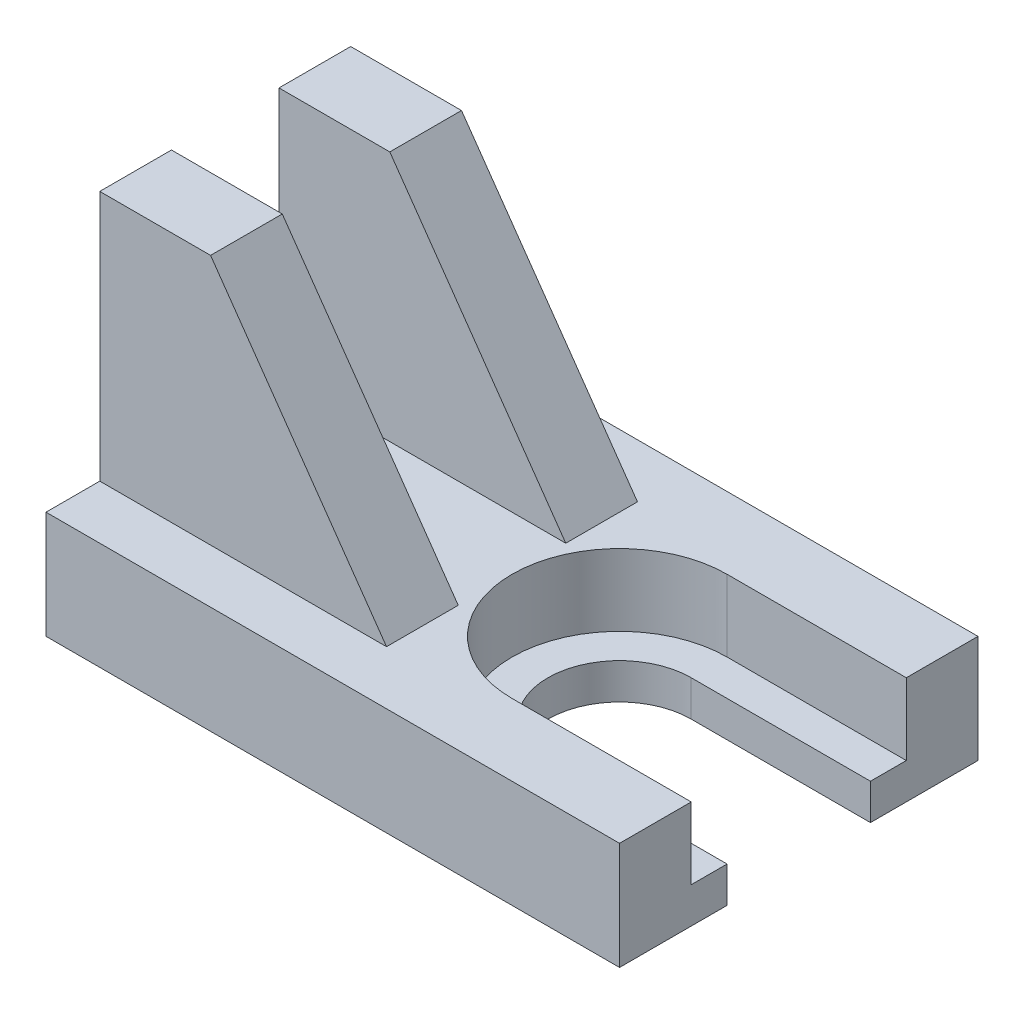
ISO-10303-21;
HEADER;
FILE_DESCRIPTION(('STEP AP214'),'2;1');
FILE_NAME('part.step','',(''),(''),'','','');
FILE_SCHEMA(('AUTOMOTIVE_DESIGN { 1 0 10303 214 1 1 1 1 }'));
ENDSEC;
DATA;
#1=APPLICATION_CONTEXT('core data for automotive mechanical design processes');
#2=APPLICATION_PROTOCOL_DEFINITION('international standard','automotive_design',2000,#1);
#3=PRODUCT_CONTEXT('',#1,'mechanical');
#4=PRODUCT('Part','Part','',(#3));
#5=PRODUCT_RELATED_PRODUCT_CATEGORY('part','',(#4));
#6=PRODUCT_DEFINITION_FORMATION('','',#4);
#7=PRODUCT_DEFINITION_CONTEXT('part definition',#1,'design');
#8=PRODUCT_DEFINITION('design','',#6,#7);
#9=PRODUCT_DEFINITION_SHAPE('','',#8);
#10=(LENGTH_UNIT() NAMED_UNIT(*) SI_UNIT(.MILLI.,.METRE.));
#11=(NAMED_UNIT(*) PLANE_ANGLE_UNIT() SI_UNIT($,.RADIAN.));
#12=(NAMED_UNIT(*) SI_UNIT($,.STERADIAN.) SOLID_ANGLE_UNIT());
#13=UNCERTAINTY_MEASURE_WITH_UNIT(LENGTH_MEASURE(1.E-05),#10,'distance_accuracy_value','');
#14=(GEOMETRIC_REPRESENTATION_CONTEXT(3) GLOBAL_UNCERTAINTY_ASSIGNED_CONTEXT((#13)) GLOBAL_UNIT_ASSIGNED_CONTEXT((#10,
#11,#12)) REPRESENTATION_CONTEXT('',''));
#15=CARTESIAN_POINT('',(0.,0.,0.));
#16=DIRECTION('',(0.,0.,1.));
#17=DIRECTION('',(1.,0.,0.));
#18=AXIS2_PLACEMENT_3D('',#15,#16,#17);
#19=CARTESIAN_POINT('',(0.,15.,0.));
#20=DIRECTION('',(0.,-1.,0.));
#21=DIRECTION('',(0.,0.,-1.));
#22=AXIS2_PLACEMENT_3D('',#19,#20,#21);
#23=PLANE('',#22);
#24=DIRECTION('',(1.,0.,0.));
#25=VECTOR('',#24,1.);
#26=CARTESIAN_POINT('',(-40.,15.,-7.5));
#27=LINE('',#26,#25);
#28=CARTESIAN_POINT('',(-40.,15.,-7.5));
#29=VERTEX_POINT('',#28);
#30=CARTESIAN_POINT('',(0.,15.,-7.5));
#31=VERTEX_POINT('',#30);
#32=EDGE_CURVE('E189',#29,#31,#27,.T.);
#33=ORIENTED_EDGE('',*,*,#32,.F.);
#34=DIRECTION('',(0.,0.,1.));
#35=VECTOR('',#34,1.);
#36=CARTESIAN_POINT('',(-40.,15.,25.));
#37=LINE('',#36,#35);
#38=CARTESIAN_POINT('',(-40.,15.,7.5));
#39=VERTEX_POINT('',#38);
#40=EDGE_CURVE('E176',#29,#39,#37,.T.);
#41=ORIENTED_EDGE('',*,*,#40,.T.);
#42=DIRECTION('',(1.,0.,0.));
#43=VECTOR('',#42,1.);
#44=CARTESIAN_POINT('',(-40.,15.,7.5));
#45=LINE('',#44,#43);
#46=CARTESIAN_POINT('',(0.,15.,7.5));
#47=VERTEX_POINT('',#46);
#48=EDGE_CURVE('E216',#39,#47,#45,.T.);
#49=ORIENTED_EDGE('',*,*,#48,.T.);
#50=DIRECTION('',(0.,0.,1.));
#51=VECTOR('',#50,1.);
#52=CARTESIAN_POINT('',(0.,15.,7.5));
#53=LINE('',#52,#51);
#54=CARTESIAN_POINT('',(0.,15.,17.5));
#55=VERTEX_POINT('',#54);
#56=EDGE_CURVE('E226',#47,#55,#53,.T.);
#57=ORIENTED_EDGE('',*,*,#56,.T.);
#58=DIRECTION('',(1.,0.,0.));
#59=VECTOR('',#58,1.);
#60=CARTESIAN_POINT('',(-40.,15.,17.5));
#61=LINE('',#60,#59);
#62=CARTESIAN_POINT('',(-40.,15.,17.5));
#63=VERTEX_POINT('',#62);
#64=EDGE_CURVE('E211',#63,#55,#61,.T.);
#65=ORIENTED_EDGE('',*,*,#64,.F.);
#66=CARTESIAN_POINT('',(-40.,15.,25.));
#67=VERTEX_POINT('',#66);
#68=EDGE_CURVE('E186',#63,#67,#37,.T.);
#69=ORIENTED_EDGE('',*,*,#68,.T.);
#70=DIRECTION('',(1.,0.,0.));
#71=VECTOR('',#70,1.);
#72=CARTESIAN_POINT('',(-40.,15.,25.));
#73=LINE('',#72,#71);
#74=CARTESIAN_POINT('',(40.,15.,25.));
#75=VERTEX_POINT('',#74);
#76=EDGE_CURVE('E301',#67,#75,#73,.T.);
#77=ORIENTED_EDGE('',*,*,#76,.T.);
#78=DIRECTION('',(0.,0.,-1.));
#79=VECTOR('',#78,1.);
#80=CARTESIAN_POINT('',(40.,15.,25.));
#81=LINE('',#80,#79);
#82=CARTESIAN_POINT('',(40.,15.,15.));
#83=VERTEX_POINT('',#82);
#84=EDGE_CURVE('E295',#75,#83,#81,.T.);
#85=ORIENTED_EDGE('',*,*,#84,.T.);
#86=DIRECTION('',(1.,0.,0.));
#87=VECTOR('',#86,1.);
#88=CARTESIAN_POINT('',(40.,15.,15.));
#89=LINE('',#88,#87);
#90=CARTESIAN_POINT('',(15.,15.,15.));
#91=VERTEX_POINT('',#90);
#92=EDGE_CURVE('E284',#91,#83,#89,.T.);
#93=ORIENTED_EDGE('',*,*,#92,.F.);
#94=CARTESIAN_POINT('',(15.,15.,0.));
#95=DIRECTION('',(0.,1.,0.));
#96=DIRECTION('',(0.,0.,1.));
#97=AXIS2_PLACEMENT_3D('',#94,#95,#96);
#98=CIRCLE('',#97,15.);
#99=CARTESIAN_POINT('',(15.,15.,-15.));
#100=VERTEX_POINT('',#99);
#101=EDGE_CURVE('E281',#100,#91,#98,.T.);
#102=ORIENTED_EDGE('',*,*,#101,.F.);
#103=DIRECTION('',(-1.,0.,0.));
#104=VECTOR('',#103,1.);
#105=CARTESIAN_POINT('',(40.,15.,-15.));
#106=LINE('',#105,#104);
#107=CARTESIAN_POINT('',(40.,15.,-15.));
#108=VERTEX_POINT('',#107);
#109=EDGE_CURVE('E264',#108,#100,#106,.T.);
#110=ORIENTED_EDGE('',*,*,#109,.F.);
#111=CARTESIAN_POINT('',(40.,15.,-25.));
#112=VERTEX_POINT('',#111);
#113=EDGE_CURVE('E299',#108,#112,#81,.T.);
#114=ORIENTED_EDGE('',*,*,#113,.T.);
#115=DIRECTION('',(-1.,0.,0.));
#116=VECTOR('',#115,1.);
#117=CARTESIAN_POINT('',(-40.,15.,-25.));
#118=LINE('',#117,#116);
#119=CARTESIAN_POINT('',(-40.,15.,-25.));
#120=VERTEX_POINT('',#119);
#121=EDGE_CURVE('E298',#112,#120,#118,.T.);
#122=ORIENTED_EDGE('',*,*,#121,.T.);
#123=CARTESIAN_POINT('',(-40.,15.,-17.5));
#124=VERTEX_POINT('',#123);
#125=EDGE_CURVE('E185',#120,#124,#37,.T.);
#126=ORIENTED_EDGE('',*,*,#125,.T.);
#127=DIRECTION('',(1.,0.,0.));
#128=VECTOR('',#127,1.);
#129=CARTESIAN_POINT('',(-40.,15.,-17.5));
#130=LINE('',#129,#128);
#131=CARTESIAN_POINT('',(0.,15.,-17.5));
#132=VERTEX_POINT('',#131);
#133=EDGE_CURVE('E59',#124,#132,#130,.T.);
#134=ORIENTED_EDGE('',*,*,#133,.T.);
#135=DIRECTION('',(0.,0.,-1.));
#136=VECTOR('',#135,1.);
#137=CARTESIAN_POINT('',(0.,15.,-7.5));
#138=LINE('',#137,#136);
#139=EDGE_CURVE('E54',#31,#132,#138,.T.);
#140=ORIENTED_EDGE('',*,*,#139,.F.);
#141=EDGE_LOOP('',(#33,#41,#49,#57,#65,#69,#77,#85,#93,#102,#110,#114,#122,#126,#134,#140));
#142=FACE_BOUND('',#141,.T.);
#143=ADVANCED_FACE('F39',(#142),#23,.F.);
#144=CARTESIAN_POINT('',(40.,15.,25.));
#145=DIRECTION('',(-1.,0.,0.));
#146=DIRECTION('',(0.,0.,1.));
#147=AXIS2_PLACEMENT_3D('',#144,#145,#146);
#148=PLANE('',#147);
#149=DIRECTION('',(0.,0.,-1.));
#150=VECTOR('',#149,1.);
#151=CARTESIAN_POINT('',(40.,0.,25.));
#152=LINE('',#151,#150);
#153=CARTESIAN_POINT('',(40.,0.,25.));
#154=VERTEX_POINT('',#153);
#155=CARTESIAN_POINT('',(40.,0.,10.));
#156=VERTEX_POINT('',#155);
#157=EDGE_CURVE('E304',#154,#156,#152,.T.);
#158=ORIENTED_EDGE('',*,*,#157,.T.);
#159=DIRECTION('',(0.,1.,0.));
#160=VECTOR('',#159,1.);
#161=CARTESIAN_POINT('',(40.,-5.,10.));
#162=LINE('',#161,#160);
#163=CARTESIAN_POINT('',(40.,5.,10.));
#164=VERTEX_POINT('',#163);
#165=EDGE_CURVE('E250',#156,#164,#162,.T.);
#166=ORIENTED_EDGE('',*,*,#165,.T.);
#167=DIRECTION('',(0.,0.,-1.));
#168=VECTOR('',#167,1.);
#169=CARTESIAN_POINT('',(40.,5.,15.));
#170=LINE('',#169,#168);
#171=CARTESIAN_POINT('',(40.,5.,15.));
#172=VERTEX_POINT('',#171);
#173=EDGE_CURVE('E265',#172,#164,#170,.T.);
#174=ORIENTED_EDGE('',*,*,#173,.F.);
#175=DIRECTION('',(0.,1.,0.));
#176=VECTOR('',#175,1.);
#177=CARTESIAN_POINT('',(40.,5.,15.));
#178=LINE('',#177,#176);
#179=EDGE_CURVE('E286',#172,#83,#178,.T.);
#180=ORIENTED_EDGE('',*,*,#179,.T.);
#181=ORIENTED_EDGE('',*,*,#84,.F.);
#182=DIRECTION('',(0.,-1.,0.));
#183=VECTOR('',#182,1.);
#184=CARTESIAN_POINT('',(40.,15.,25.));
#185=LINE('',#184,#183);
#186=EDGE_CURVE('E303',#75,#154,#185,.T.);
#187=ORIENTED_EDGE('',*,*,#186,.T.);
#188=EDGE_LOOP('',(#158,#166,#174,#180,#181,#187));
#189=FACE_BOUND('',#188,.T.);
#190=ADVANCED_FACE('F337',(#189),#148,.F.);
#191=CARTESIAN_POINT('',(40.,5.,-10.));
#192=VERTEX_POINT('',#191);
#193=CARTESIAN_POINT('',(40.,5.,-15.));
#194=VERTEX_POINT('',#193);
#195=EDGE_CURVE('E269',#192,#194,#170,.T.);
#196=ORIENTED_EDGE('',*,*,#195,.F.);
#197=DIRECTION('',(0.,1.,0.));
#198=VECTOR('',#197,1.);
#199=CARTESIAN_POINT('',(40.,-5.,-10.));
#200=LINE('',#199,#198);
#201=CARTESIAN_POINT('',(40.,0.,-10.));
#202=VERTEX_POINT('',#201);
#203=EDGE_CURVE('E249',#202,#192,#200,.T.);
#204=ORIENTED_EDGE('',*,*,#203,.F.);
#205=CARTESIAN_POINT('',(40.,0.,-25.));
#206=VERTEX_POINT('',#205);
#207=EDGE_CURVE('E289',#202,#206,#152,.T.);
#208=ORIENTED_EDGE('',*,*,#207,.T.);
#209=DIRECTION('',(0.,-1.,0.));
#210=VECTOR('',#209,1.);
#211=CARTESIAN_POINT('',(40.,15.,-25.));
#212=LINE('',#211,#210);
#213=EDGE_CURVE('E11',#112,#206,#212,.T.);
#214=ORIENTED_EDGE('',*,*,#213,.F.);
#215=ORIENTED_EDGE('',*,*,#113,.F.);
#216=DIRECTION('',(0.,1.,0.));
#217=VECTOR('',#216,1.);
#218=CARTESIAN_POINT('',(40.,5.,-15.));
#219=LINE('',#218,#217);
#220=EDGE_CURVE('E278',#194,#108,#219,.T.);
#221=ORIENTED_EDGE('',*,*,#220,.F.);
#222=EDGE_LOOP('',(#196,#204,#208,#214,#215,#221));
#223=FACE_BOUND('',#222,.T.);
#224=ADVANCED_FACE('F41',(#223),#148,.F.);
#225=CARTESIAN_POINT('',(-40.,15.,-25.));
#226=DIRECTION('',(0.,0.,1.));
#227=DIRECTION('',(1.,0.,0.));
#228=AXIS2_PLACEMENT_3D('',#225,#226,#227);
#229=PLANE('',#228);
#230=DIRECTION('',(-1.,0.,0.));
#231=VECTOR('',#230,1.);
#232=CARTESIAN_POINT('',(-40.,0.,-25.));
#233=LINE('',#232,#231);
#234=CARTESIAN_POINT('',(-40.,0.,-25.));
#235=VERTEX_POINT('',#234);
#236=EDGE_CURVE('E307',#206,#235,#233,.T.);
#237=ORIENTED_EDGE('',*,*,#236,.T.);
#238=DIRECTION('',(0.,-1.,0.));
#239=VECTOR('',#238,1.);
#240=CARTESIAN_POINT('',(-40.,15.,-25.));
#241=LINE('',#240,#239);
#242=EDGE_CURVE('E47',#120,#235,#241,.T.);
#243=ORIENTED_EDGE('',*,*,#242,.F.);
#244=ORIENTED_EDGE('',*,*,#121,.F.);
#245=ORIENTED_EDGE('',*,*,#213,.T.);
#246=EDGE_LOOP('',(#237,#243,#244,#245));
#247=FACE_BOUND('',#246,.T.);
#248=ADVANCED_FACE('F382',(#247),#229,.F.);
#249=CARTESIAN_POINT('',(-40.,15.,25.));
#250=DIRECTION('',(1.,0.,0.));
#251=DIRECTION('',(0.,0.,-1.));
#252=AXIS2_PLACEMENT_3D('',#249,#250,#251);
#253=PLANE('',#252);
#254=DIRECTION('',(0.,0.,1.));
#255=VECTOR('',#254,1.);
#256=CARTESIAN_POINT('',(-40.,0.,25.));
#257=LINE('',#256,#255);
#258=CARTESIAN_POINT('',(-40.,0.,25.));
#259=VERTEX_POINT('',#258);
#260=EDGE_CURVE('E309',#235,#259,#257,.T.);
#261=ORIENTED_EDGE('',*,*,#260,.T.);
#262=DIRECTION('',(0.,-1.,0.));
#263=VECTOR('',#262,1.);
#264=CARTESIAN_POINT('',(-40.,15.,25.));
#265=LINE('',#264,#263);
#266=EDGE_CURVE('E315',#67,#259,#265,.T.);
#267=ORIENTED_EDGE('',*,*,#266,.F.);
#268=ORIENTED_EDGE('',*,*,#68,.F.);
#269=DIRECTION('',(0.,-1.,0.));
#270=VECTOR('',#269,1.);
#271=CARTESIAN_POINT('',(-40.,15.,17.5));
#272=LINE('',#271,#270);
#273=CARTESIAN_POINT('',(-40.,50.,17.5));
#274=VERTEX_POINT('',#273);
#275=EDGE_CURVE('E219',#274,#63,#272,.T.);
#276=ORIENTED_EDGE('',*,*,#275,.F.);
#277=DIRECTION('',(0.,0.,1.));
#278=VECTOR('',#277,1.);
#279=CARTESIAN_POINT('',(-40.,50.,7.5));
#280=LINE('',#279,#278);
#281=CARTESIAN_POINT('',(-40.,50.,7.5));
#282=VERTEX_POINT('',#281);
#283=EDGE_CURVE('E235',#282,#274,#280,.T.);
#284=ORIENTED_EDGE('',*,*,#283,.F.);
#285=DIRECTION('',(0.,-1.,0.));
#286=VECTOR('',#285,1.);
#287=CARTESIAN_POINT('',(-40.,15.,7.5));
#288=LINE('',#287,#286);
#289=EDGE_CURVE('E182',#282,#39,#288,.T.);
#290=ORIENTED_EDGE('',*,*,#289,.T.);
#291=ORIENTED_EDGE('',*,*,#40,.F.);
#292=DIRECTION('',(0.,-1.,0.));
#293=VECTOR('',#292,1.);
#294=CARTESIAN_POINT('',(-40.,15.,-7.5));
#295=LINE('',#294,#293);
#296=CARTESIAN_POINT('',(-40.,50.,-7.5));
#297=VERTEX_POINT('',#296);
#298=EDGE_CURVE('E180',#297,#29,#295,.T.);
#299=ORIENTED_EDGE('',*,*,#298,.F.);
#300=DIRECTION('',(0.,0.,-1.));
#301=VECTOR('',#300,1.);
#302=CARTESIAN_POINT('',(-40.,50.,-7.5));
#303=LINE('',#302,#301);
#304=CARTESIAN_POINT('',(-40.,50.,-17.5));
#305=VERTEX_POINT('',#304);
#306=EDGE_CURVE('E202',#297,#305,#303,.T.);
#307=ORIENTED_EDGE('',*,*,#306,.T.);
#308=DIRECTION('',(0.,-1.,0.));
#309=VECTOR('',#308,1.);
#310=CARTESIAN_POINT('',(-40.,15.,-17.5));
#311=LINE('',#310,#309);
#312=EDGE_CURVE('E204',#305,#124,#311,.T.);
#313=ORIENTED_EDGE('',*,*,#312,.T.);
#314=ORIENTED_EDGE('',*,*,#125,.F.);
#315=ORIENTED_EDGE('',*,*,#242,.T.);
#316=EDGE_LOOP('',(#261,#267,#268,#276,#284,#290,#291,#299,#307,#313,#314,#315));
#317=FACE_BOUND('',#316,.T.);
#318=ADVANCED_FACE('F177',(#317),#253,.F.);
#319=CARTESIAN_POINT('',(-40.,15.,25.));
#320=DIRECTION('',(0.,0.,-1.));
#321=DIRECTION('',(-1.,0.,0.));
#322=AXIS2_PLACEMENT_3D('',#319,#320,#321);
#323=PLANE('',#322);
#324=DIRECTION('',(1.,0.,0.));
#325=VECTOR('',#324,1.);
#326=CARTESIAN_POINT('',(-40.,0.,25.));
#327=LINE('',#326,#325);
#328=EDGE_CURVE('E311',#259,#154,#327,.T.);
#329=ORIENTED_EDGE('',*,*,#328,.T.);
#330=ORIENTED_EDGE('',*,*,#186,.F.);
#331=ORIENTED_EDGE('',*,*,#76,.F.);
#332=ORIENTED_EDGE('',*,*,#266,.T.);
#333=EDGE_LOOP('',(#329,#330,#331,#332));
#334=FACE_BOUND('',#333,.T.);
#335=ADVANCED_FACE('F333',(#334),#323,.F.);
#336=CARTESIAN_POINT('',(0.,0.,0.));
#337=DIRECTION('',(0.,-1.,0.));
#338=DIRECTION('',(0.,0.,-1.));
#339=AXIS2_PLACEMENT_3D('',#336,#337,#338);
#340=PLANE('',#339);
#341=DIRECTION('',(-1.,0.,0.));
#342=VECTOR('',#341,1.);
#343=CARTESIAN_POINT('',(0.,0.,10.));
#344=LINE('',#343,#342);
#345=CARTESIAN_POINT('',(15.,0.,10.));
#346=VERTEX_POINT('',#345);
#347=EDGE_CURVE('E262',#156,#346,#344,.T.);
#348=ORIENTED_EDGE('',*,*,#347,.F.);
#349=ORIENTED_EDGE('',*,*,#157,.F.);
#350=ORIENTED_EDGE('',*,*,#328,.F.);
#351=ORIENTED_EDGE('',*,*,#260,.F.);
#352=ORIENTED_EDGE('',*,*,#236,.F.);
#353=ORIENTED_EDGE('',*,*,#207,.F.);
#354=DIRECTION('',(1.,0.,0.));
#355=VECTOR('',#354,1.);
#356=CARTESIAN_POINT('',(0.,0.,-9.99999999999999));
#357=LINE('',#356,#355);
#358=CARTESIAN_POINT('',(15.,0.,-9.99999999999999));
#359=VERTEX_POINT('',#358);
#360=EDGE_CURVE('E253',#359,#202,#357,.T.);
#361=ORIENTED_EDGE('',*,*,#360,.F.);
#362=CARTESIAN_POINT('',(15.,0.,0.));
#363=DIRECTION('',(0.,-1.,0.));
#364=DIRECTION('',(0.,0.,-1.));
#365=AXIS2_PLACEMENT_3D('',#362,#363,#364);
#366=CIRCLE('',#365,10.);
#367=EDGE_CURVE('E260',#346,#359,#366,.T.);
#368=ORIENTED_EDGE('',*,*,#367,.F.);
#369=EDGE_LOOP('',(#348,#349,#350,#351,#352,#353,#361,#368));
#370=FACE_BOUND('',#369,.T.);
#371=ADVANCED_FACE('F328',(#370),#340,.T.);
#372=CARTESIAN_POINT('',(40.,5.,15.));
#373=DIRECTION('',(0.,0.,1.));
#374=DIRECTION('',(1.,0.,0.));
#375=AXIS2_PLACEMENT_3D('',#372,#373,#374);
#376=PLANE('',#375);
#377=ORIENTED_EDGE('',*,*,#92,.T.);
#378=ORIENTED_EDGE('',*,*,#179,.F.);
#379=DIRECTION('',(1.,0.,0.));
#380=VECTOR('',#379,1.);
#381=CARTESIAN_POINT('',(40.,5.,15.));
#382=LINE('',#381,#380);
#383=CARTESIAN_POINT('',(15.,5.,15.));
#384=VERTEX_POINT('',#383);
#385=EDGE_CURVE('E275',#384,#172,#382,.T.);
#386=ORIENTED_EDGE('',*,*,#385,.F.);
#387=DIRECTION('',(0.,1.,0.));
#388=VECTOR('',#387,1.);
#389=CARTESIAN_POINT('',(15.,5.,15.));
#390=LINE('',#389,#388);
#391=EDGE_CURVE('E290',#384,#91,#390,.T.);
#392=ORIENTED_EDGE('',*,*,#391,.T.);
#393=EDGE_LOOP('',(#377,#378,#386,#392));
#394=FACE_BOUND('',#393,.T.);
#395=ADVANCED_FACE('F379',(#394),#376,.F.);
#396=CARTESIAN_POINT('',(15.,5.,0.));
#397=DIRECTION('',(0.,1.,0.));
#398=DIRECTION('',(0.,0.,1.));
#399=AXIS2_PLACEMENT_3D('',#396,#397,#398);
#400=CYLINDRICAL_SURFACE('',#399,15.);
#401=ORIENTED_EDGE('',*,*,#101,.T.);
#402=ORIENTED_EDGE('',*,*,#391,.F.);
#403=CARTESIAN_POINT('',(15.,5.,0.));
#404=DIRECTION('',(0.,1.,0.));
#405=DIRECTION('',(0.,0.,1.));
#406=AXIS2_PLACEMENT_3D('',#403,#404,#405);
#407=CIRCLE('',#406,15.);
#408=CARTESIAN_POINT('',(15.,5.,-15.));
#409=VERTEX_POINT('',#408);
#410=EDGE_CURVE('E272',#409,#384,#407,.T.);
#411=ORIENTED_EDGE('',*,*,#410,.F.);
#412=DIRECTION('',(0.,1.,0.));
#413=VECTOR('',#412,1.);
#414=CARTESIAN_POINT('',(15.,5.,-15.));
#415=LINE('',#414,#413);
#416=EDGE_CURVE('E292',#409,#100,#415,.T.);
#417=ORIENTED_EDGE('',*,*,#416,.T.);
#418=EDGE_LOOP('',(#401,#402,#411,#417));
#419=FACE_BOUND('',#418,.T.);
#420=ADVANCED_FACE('F411',(#419),#400,.F.);
#421=CARTESIAN_POINT('',(40.,5.,-15.));
#422=DIRECTION('',(0.,0.,-1.));
#423=DIRECTION('',(-1.,0.,0.));
#424=AXIS2_PLACEMENT_3D('',#421,#422,#423);
#425=PLANE('',#424);
#426=ORIENTED_EDGE('',*,*,#109,.T.);
#427=ORIENTED_EDGE('',*,*,#416,.F.);
#428=DIRECTION('',(-1.,0.,0.));
#429=VECTOR('',#428,1.);
#430=CARTESIAN_POINT('',(40.,5.,-15.));
#431=LINE('',#430,#429);
#432=EDGE_CURVE('E268',#194,#409,#431,.T.);
#433=ORIENTED_EDGE('',*,*,#432,.F.);
#434=ORIENTED_EDGE('',*,*,#220,.T.);
#435=EDGE_LOOP('',(#426,#427,#433,#434));
#436=FACE_BOUND('',#435,.T.);
#437=ADVANCED_FACE('F375',(#436),#425,.F.);
#438=CARTESIAN_POINT('',(15.,5.,0.));
#439=DIRECTION('',(0.,1.,0.));
#440=DIRECTION('',(0.,0.,1.));
#441=AXIS2_PLACEMENT_3D('',#438,#439,#440);
#442=PLANE('',#441);
#443=DIRECTION('',(1.,0.,0.));
#444=VECTOR('',#443,1.);
#445=CARTESIAN_POINT('',(40.,5.,10.));
#446=LINE('',#445,#444);
#447=CARTESIAN_POINT('',(15.,5.,10.));
#448=VERTEX_POINT('',#447);
#449=EDGE_CURVE('E247',#448,#164,#446,.T.);
#450=ORIENTED_EDGE('',*,*,#449,.F.);
#451=CARTESIAN_POINT('',(15.,5.,0.));
#452=DIRECTION('',(0.,1.,0.));
#453=DIRECTION('',(0.,0.,1.));
#454=AXIS2_PLACEMENT_3D('',#451,#452,#453);
#455=CIRCLE('',#454,10.);
#456=CARTESIAN_POINT('',(15.,5.,-9.99999999999999));
#457=VERTEX_POINT('',#456);
#458=EDGE_CURVE('E244',#457,#448,#455,.T.);
#459=ORIENTED_EDGE('',*,*,#458,.F.);
#460=DIRECTION('',(-1.,0.,0.));
#461=VECTOR('',#460,1.);
#462=CARTESIAN_POINT('',(40.,5.,-10.));
#463=LINE('',#462,#461);
#464=EDGE_CURVE('E237',#192,#457,#463,.T.);
#465=ORIENTED_EDGE('',*,*,#464,.F.);
#466=ORIENTED_EDGE('',*,*,#195,.T.);
#467=ORIENTED_EDGE('',*,*,#432,.T.);
#468=ORIENTED_EDGE('',*,*,#410,.T.);
#469=ORIENTED_EDGE('',*,*,#385,.T.);
#470=ORIENTED_EDGE('',*,*,#173,.T.);
#471=EDGE_LOOP('',(#450,#459,#465,#466,#467,#468,#469,#470));
#472=FACE_BOUND('',#471,.T.);
#473=ADVANCED_FACE('F406',(#472),#442,.T.);
#474=CARTESIAN_POINT('',(40.,-5.,10.));
#475=DIRECTION('',(0.,0.,1.));
#476=DIRECTION('',(1.,0.,0.));
#477=AXIS2_PLACEMENT_3D('',#474,#475,#476);
#478=PLANE('',#477);
#479=ORIENTED_EDGE('',*,*,#347,.T.);
#480=DIRECTION('',(0.,1.,0.));
#481=VECTOR('',#480,1.);
#482=CARTESIAN_POINT('',(15.,-5.,10.));
#483=LINE('',#482,#481);
#484=EDGE_CURVE('E254',#346,#448,#483,.T.);
#485=ORIENTED_EDGE('',*,*,#484,.T.);
#486=ORIENTED_EDGE('',*,*,#449,.T.);
#487=ORIENTED_EDGE('',*,*,#165,.F.);
#488=EDGE_LOOP('',(#479,#485,#486,#487));
#489=FACE_BOUND('',#488,.T.);
#490=ADVANCED_FACE('F404',(#489),#478,.F.);
#491=CARTESIAN_POINT('',(15.,-5.,0.));
#492=DIRECTION('',(0.,1.,0.));
#493=DIRECTION('',(0.,0.,1.));
#494=AXIS2_PLACEMENT_3D('',#491,#492,#493);
#495=CYLINDRICAL_SURFACE('',#494,10.);
#496=ORIENTED_EDGE('',*,*,#367,.T.);
#497=DIRECTION('',(0.,1.,0.));
#498=VECTOR('',#497,1.);
#499=CARTESIAN_POINT('',(15.,-5.,-9.99999999999999));
#500=LINE('',#499,#498);
#501=EDGE_CURVE('E256',#359,#457,#500,.T.);
#502=ORIENTED_EDGE('',*,*,#501,.T.);
#503=ORIENTED_EDGE('',*,*,#458,.T.);
#504=ORIENTED_EDGE('',*,*,#484,.F.);
#505=EDGE_LOOP('',(#496,#502,#503,#504));
#506=FACE_BOUND('',#505,.T.);
#507=ADVANCED_FACE('F400',(#506),#495,.F.);
#508=CARTESIAN_POINT('',(40.,-5.,-10.));
#509=DIRECTION('',(0.,0.,-1.));
#510=DIRECTION('',(-1.,0.,0.));
#511=AXIS2_PLACEMENT_3D('',#508,#509,#510);
#512=PLANE('',#511);
#513=ORIENTED_EDGE('',*,*,#360,.T.);
#514=ORIENTED_EDGE('',*,*,#203,.T.);
#515=ORIENTED_EDGE('',*,*,#464,.T.);
#516=ORIENTED_EDGE('',*,*,#501,.F.);
#517=EDGE_LOOP('',(#513,#514,#515,#516));
#518=FACE_BOUND('',#517,.T.);
#519=ADVANCED_FACE('F363',(#518),#512,.F.);
#520=CARTESIAN_POINT('',(-40.,50.,7.5));
#521=DIRECTION('',(0.,1.,0.));
#522=DIRECTION('',(0.,0.,1.));
#523=AXIS2_PLACEMENT_3D('',#520,#521,#522);
#524=PLANE('',#523);
#525=DIRECTION('',(-1.,0.,0.));
#526=VECTOR('',#525,1.);
#527=CARTESIAN_POINT('',(-40.,50.,17.5));
#528=LINE('',#527,#526);
#529=CARTESIAN_POINT('',(-24.5433010650402,50.,17.5));
#530=VERTEX_POINT('',#529);
#531=EDGE_CURVE('E231',#530,#274,#528,.T.);
#532=ORIENTED_EDGE('',*,*,#531,.F.);
#533=DIRECTION('',(0.,0.,1.));
#534=VECTOR('',#533,1.);
#535=CARTESIAN_POINT('',(-24.5433010650402,50.,7.5));
#536=LINE('',#535,#534);
#537=CARTESIAN_POINT('',(-24.5433010650402,50.,7.5));
#538=VERTEX_POINT('',#537);
#539=EDGE_CURVE('E238',#538,#530,#536,.T.);
#540=ORIENTED_EDGE('',*,*,#539,.F.);
#541=DIRECTION('',(-1.,0.,0.));
#542=VECTOR('',#541,1.);
#543=CARTESIAN_POINT('',(-40.,50.,7.5));
#544=LINE('',#543,#542);
#545=EDGE_CURVE('E222',#538,#282,#544,.T.);
#546=ORIENTED_EDGE('',*,*,#545,.T.);
#547=ORIENTED_EDGE('',*,*,#283,.T.);
#548=EDGE_LOOP('',(#532,#540,#546,#547));
#549=FACE_BOUND('',#548,.T.);
#550=ADVANCED_FACE('F349',(#549),#524,.T.);
#551=CARTESIAN_POINT('',(-24.5433010650402,50.,7.5));
#552=DIRECTION('',(0.8187557593006,0.574141974264291,0.));
#553=DIRECTION('',(-0.574141974264292,0.8187557593006,0.));
#554=AXIS2_PLACEMENT_3D('',#551,#552,#553);
#555=PLANE('',#554);
#556=DIRECTION('',(-0.574141974264291,0.8187557593006,0.));
#557=VECTOR('',#556,1.);
#558=CARTESIAN_POINT('',(-24.5433010650402,50.,17.5));
#559=LINE('',#558,#557);
#560=EDGE_CURVE('E228',#55,#530,#559,.T.);
#561=ORIENTED_EDGE('',*,*,#560,.F.);
#562=ORIENTED_EDGE('',*,*,#56,.F.);
#563=DIRECTION('',(-0.574141974264291,0.8187557593006,0.));
#564=VECTOR('',#563,1.);
#565=CARTESIAN_POINT('',(-24.5433010650402,50.,7.5));
#566=LINE('',#565,#564);
#567=EDGE_CURVE('E218',#47,#538,#566,.T.);
#568=ORIENTED_EDGE('',*,*,#567,.T.);
#569=ORIENTED_EDGE('',*,*,#539,.T.);
#570=EDGE_LOOP('',(#561,#562,#568,#569));
#571=FACE_BOUND('',#570,.T.);
#572=ADVANCED_FACE('F355',(#571),#555,.T.);
#573=CARTESIAN_POINT('',(0.,0.,7.5));
#574=DIRECTION('',(0.,0.,1.));
#575=DIRECTION('',(1.,0.,0.));
#576=AXIS2_PLACEMENT_3D('',#573,#574,#575);
#577=PLANE('',#576);
#578=ORIENTED_EDGE('',*,*,#48,.F.);
#579=ORIENTED_EDGE('',*,*,#289,.F.);
#580=ORIENTED_EDGE('',*,*,#545,.F.);
#581=ORIENTED_EDGE('',*,*,#567,.F.);
#582=EDGE_LOOP('',(#578,#579,#580,#581));
#583=FACE_BOUND('',#582,.T.);
#584=ADVANCED_FACE('F353',(#583),#577,.F.);
#585=CARTESIAN_POINT('',(0.,0.,17.5));
#586=DIRECTION('',(0.,0.,1.));
#587=DIRECTION('',(1.,0.,0.));
#588=AXIS2_PLACEMENT_3D('',#585,#586,#587);
#589=PLANE('',#588);
#590=ORIENTED_EDGE('',*,*,#64,.T.);
#591=ORIENTED_EDGE('',*,*,#560,.T.);
#592=ORIENTED_EDGE('',*,*,#531,.T.);
#593=ORIENTED_EDGE('',*,*,#275,.T.);
#594=EDGE_LOOP('',(#590,#591,#592,#593));
#595=FACE_BOUND('',#594,.T.);
#596=ADVANCED_FACE('F345',(#595),#589,.T.);
#597=CARTESIAN_POINT('',(-24.5433010650402,50.,-7.5));
#598=DIRECTION('',(-0.8187557593006,-0.574141974264291,0.));
#599=DIRECTION('',(0.574141974264292,-0.8187557593006,0.));
#600=AXIS2_PLACEMENT_3D('',#597,#598,#599);
#601=PLANE('',#600);
#602=DIRECTION('',(-0.574141974264291,0.8187557593006,0.));
#603=VECTOR('',#602,1.);
#604=CARTESIAN_POINT('',(-24.5433010650402,50.,-17.5));
#605=LINE('',#604,#603);
#606=CARTESIAN_POINT('',(-24.5433010650402,50.,-17.5));
#607=VERTEX_POINT('',#606);
#608=EDGE_CURVE('E191',#132,#607,#605,.T.);
#609=ORIENTED_EDGE('',*,*,#608,.T.);
#610=DIRECTION('',(0.,0.,-1.));
#611=VECTOR('',#610,1.);
#612=CARTESIAN_POINT('',(-24.5433010650402,50.,-7.5));
#613=LINE('',#612,#611);
#614=CARTESIAN_POINT('',(-24.5433010650402,50.,-7.5));
#615=VERTEX_POINT('',#614);
#616=EDGE_CURVE('E212',#615,#607,#613,.T.);
#617=ORIENTED_EDGE('',*,*,#616,.F.);
#618=DIRECTION('',(-0.574141974264291,0.8187557593006,0.));
#619=VECTOR('',#618,1.);
#620=CARTESIAN_POINT('',(-24.5433010650402,50.,-7.5));
#621=LINE('',#620,#619);
#622=EDGE_CURVE('E198',#31,#615,#621,.T.);
#623=ORIENTED_EDGE('',*,*,#622,.F.);
#624=ORIENTED_EDGE('',*,*,#139,.T.);
#625=EDGE_LOOP('',(#609,#617,#623,#624));
#626=FACE_BOUND('',#625,.T.);
#627=ADVANCED_FACE('F473',(#626),#601,.F.);
#628=CARTESIAN_POINT('',(-40.,50.,-7.5));
#629=DIRECTION('',(0.,-1.,0.));
#630=DIRECTION('',(0.,0.,-1.));
#631=AXIS2_PLACEMENT_3D('',#628,#629,#630);
#632=PLANE('',#631);
#633=DIRECTION('',(-1.,0.,0.));
#634=VECTOR('',#633,1.);
#635=CARTESIAN_POINT('',(-40.,50.,-17.5));
#636=LINE('',#635,#634);
#637=EDGE_CURVE('E207',#607,#305,#636,.T.);
#638=ORIENTED_EDGE('',*,*,#637,.T.);
#639=ORIENTED_EDGE('',*,*,#306,.F.);
#640=DIRECTION('',(-1.,0.,0.));
#641=VECTOR('',#640,1.);
#642=CARTESIAN_POINT('',(-40.,50.,-7.5));
#643=LINE('',#642,#641);
#644=EDGE_CURVE('E195',#615,#297,#643,.T.);
#645=ORIENTED_EDGE('',*,*,#644,.F.);
#646=ORIENTED_EDGE('',*,*,#616,.T.);
#647=EDGE_LOOP('',(#638,#639,#645,#646));
#648=FACE_BOUND('',#647,.T.);
#649=ADVANCED_FACE('F490',(#648),#632,.F.);
#650=CARTESIAN_POINT('',(0.,0.,-7.5));
#651=DIRECTION('',(0.,0.,-1.));
#652=DIRECTION('',(1.,0.,0.));
#653=AXIS2_PLACEMENT_3D('',#650,#651,#652);
#654=PLANE('',#653);
#655=ORIENTED_EDGE('',*,*,#32,.T.);
#656=ORIENTED_EDGE('',*,*,#622,.T.);
#657=ORIENTED_EDGE('',*,*,#644,.T.);
#658=ORIENTED_EDGE('',*,*,#298,.T.);
#659=EDGE_LOOP('',(#655,#656,#657,#658));
#660=FACE_BOUND('',#659,.T.);
#661=ADVANCED_FACE('F193',(#660),#654,.F.);
#662=CARTESIAN_POINT('',(0.,0.,-17.5));
#663=DIRECTION('',(0.,0.,-1.));
#664=DIRECTION('',(1.,0.,0.));
#665=AXIS2_PLACEMENT_3D('',#662,#663,#664);
#666=PLANE('',#665);
#667=ORIENTED_EDGE('',*,*,#133,.F.);
#668=ORIENTED_EDGE('',*,*,#312,.F.);
#669=ORIENTED_EDGE('',*,*,#637,.F.);
#670=ORIENTED_EDGE('',*,*,#608,.F.);
#671=EDGE_LOOP('',(#667,#668,#669,#670));
#672=FACE_BOUND('',#671,.T.);
#673=ADVANCED_FACE('F509',(#672),#666,.T.);
#674=CLOSED_SHELL('',(#143,#190,#224,#248,#318,#335,#371,#395,#420,#437,#473,#490,#507,#519,
#550,#572,#584,#596,#627,#649,#661,#673));
#675=MANIFOLD_SOLID_BREP('B2',#674);
#676=ADVANCED_BREP_SHAPE_REPRESENTATION('',(#18,#675),#14);
#677=SHAPE_DEFINITION_REPRESENTATION(#9,#676);
ENDSEC;
END-ISO-10303-21;
